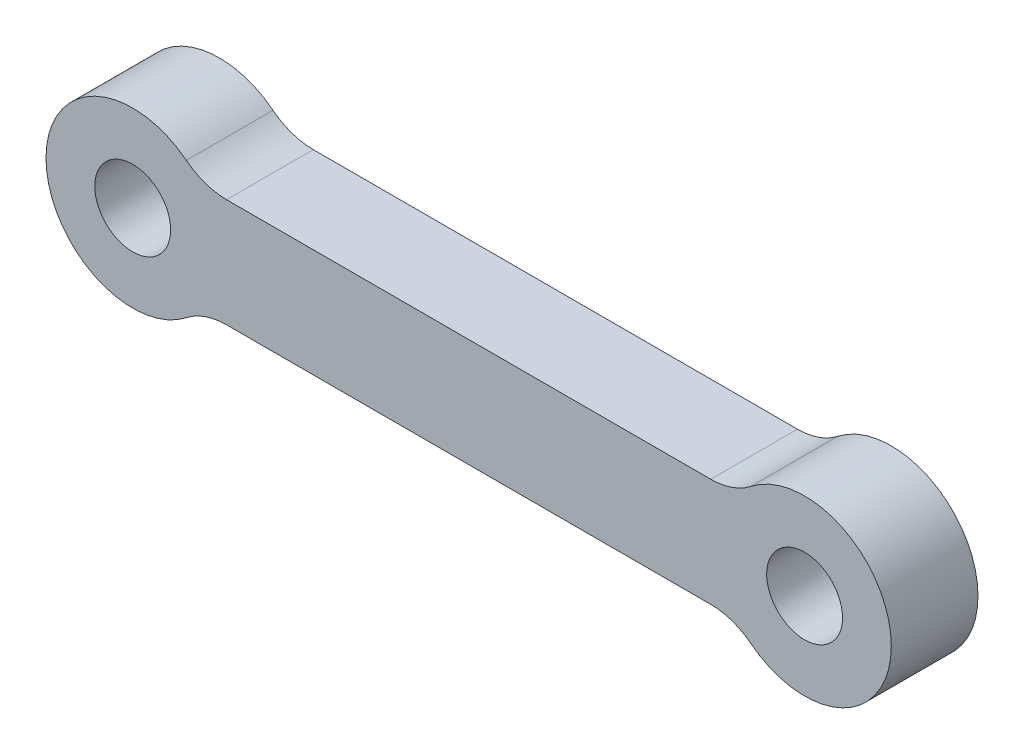
ISO-10303-21;
HEADER;
FILE_DESCRIPTION(('STEP AP214'),'2;1');
FILE_NAME('part.step','',(''),(''),'','','');
FILE_SCHEMA(('AUTOMOTIVE_DESIGN { 1 0 10303 214 1 1 1 1 }'));
ENDSEC;
DATA;
#1=APPLICATION_CONTEXT('core data for automotive mechanical design processes');
#2=APPLICATION_PROTOCOL_DEFINITION('international standard','automotive_design',2000,#1);
#3=PRODUCT_CONTEXT('',#1,'mechanical');
#4=PRODUCT('Part','Part','',(#3));
#5=PRODUCT_RELATED_PRODUCT_CATEGORY('part','',(#4));
#6=PRODUCT_DEFINITION_FORMATION('','',#4);
#7=PRODUCT_DEFINITION_CONTEXT('part definition',#1,'design');
#8=PRODUCT_DEFINITION('design','',#6,#7);
#9=PRODUCT_DEFINITION_SHAPE('','',#8);
#10=(LENGTH_UNIT() NAMED_UNIT(*) SI_UNIT(.MILLI.,.METRE.));
#11=(NAMED_UNIT(*) PLANE_ANGLE_UNIT() SI_UNIT($,.RADIAN.));
#12=(NAMED_UNIT(*) SI_UNIT($,.STERADIAN.) SOLID_ANGLE_UNIT());
#13=UNCERTAINTY_MEASURE_WITH_UNIT(LENGTH_MEASURE(1.E-05),#10,'distance_accuracy_value','');
#14=(GEOMETRIC_REPRESENTATION_CONTEXT(3) GLOBAL_UNCERTAINTY_ASSIGNED_CONTEXT((#13)) GLOBAL_UNIT_ASSIGNED_CONTEXT((#10,
#11,#12)) REPRESENTATION_CONTEXT('',''));
#15=CARTESIAN_POINT('',(0.,0.,0.));
#16=DIRECTION('',(0.,0.,1.));
#17=DIRECTION('',(1.,0.,0.));
#18=AXIS2_PLACEMENT_3D('',#15,#16,#17);
#19=CARTESIAN_POINT('',(-15.5,0.,4.));
#20=DIRECTION('',(0.,0.,-1.));
#21=DIRECTION('',(-1.,0.,0.));
#22=AXIS2_PLACEMENT_3D('',#19,#20,#21);
#23=CYLINDRICAL_SURFACE('',#22,4.);
#24=CARTESIAN_POINT('',(-15.5,0.,0.));
#25=DIRECTION('',(0.,0.,1.));
#26=DIRECTION('',(1.,0.,0.));
#27=AXIS2_PLACEMENT_3D('',#24,#25,#26);
#28=CIRCLE('',#27,4.);
#29=CARTESIAN_POINT('',(-13.025641703473,-3.14285714285714,0.));
#30=VERTEX_POINT('',#29);
#31=CARTESIAN_POINT('',(-13.025641703473,3.14285714285714,0.));
#32=VERTEX_POINT('',#31);
#33=EDGE_CURVE('E158',#30,#32,#28,.F.);
#34=ORIENTED_EDGE('',*,*,#33,.F.);
#35=DIRECTION('',(0.,0.,-1.));
#36=VECTOR('',#35,1.);
#37=CARTESIAN_POINT('',(-13.025641703473,-3.14285714285714,4.));
#38=LINE('',#37,#36);
#39=CARTESIAN_POINT('',(-13.025641703473,-3.14285714285714,4.));
#40=VERTEX_POINT('',#39);
#41=EDGE_CURVE('E182',#30,#40,#38,.F.);
#42=ORIENTED_EDGE('',*,*,#41,.T.);
#43=CARTESIAN_POINT('',(-15.5,0.,4.));
#44=DIRECTION('',(0.,0.,1.));
#45=DIRECTION('',(1.,0.,0.));
#46=AXIS2_PLACEMENT_3D('',#43,#44,#45);
#47=CIRCLE('',#46,4.);
#48=CARTESIAN_POINT('',(-13.025641703473,3.14285714285714,4.));
#49=VERTEX_POINT('',#48);
#50=EDGE_CURVE('E169',#40,#49,#47,.F.);
#51=ORIENTED_EDGE('',*,*,#50,.T.);
#52=DIRECTION('',(0.,0.,-1.));
#53=VECTOR('',#52,1.);
#54=CARTESIAN_POINT('',(-13.025641703473,3.14285714285714,4.));
#55=LINE('',#54,#53);
#56=EDGE_CURVE('E178',#49,#32,#55,.T.);
#57=ORIENTED_EDGE('',*,*,#56,.T.);
#58=EDGE_LOOP('',(#34,#42,#51,#57));
#59=FACE_BOUND('',#58,.T.);
#60=ADVANCED_FACE('F54',(#59),#23,.T.);
#61=CARTESIAN_POINT('',(0.,-2.5,4.));
#62=DIRECTION('',(0.,1.,0.));
#63=DIRECTION('',(-1.,0.,0.));
#64=AXIS2_PLACEMENT_3D('',#61,#62,#63);
#65=PLANE('',#64);
#66=DIRECTION('',(1.,0.,0.));
#67=VECTOR('',#66,1.);
#68=CARTESIAN_POINT('',(0.,-2.5,0.));
#69=LINE('',#68,#67);
#70=CARTESIAN_POINT('',(-11.1698729810778,-2.5,0.));
#71=VERTEX_POINT('',#70);
#72=CARTESIAN_POINT('',(11.1698729810778,-2.5,0.));
#73=VERTEX_POINT('',#72);
#74=EDGE_CURVE('E152',#71,#73,#69,.T.);
#75=ORIENTED_EDGE('',*,*,#74,.T.);
#76=DIRECTION('',(0.,0.,1.));
#77=VECTOR('',#76,1.);
#78=CARTESIAN_POINT('',(11.1698729810778,-2.5,4.));
#79=LINE('',#78,#77);
#80=CARTESIAN_POINT('',(11.1698729810778,-2.5,4.));
#81=VERTEX_POINT('',#80);
#82=EDGE_CURVE('E126',#73,#81,#79,.T.);
#83=ORIENTED_EDGE('',*,*,#82,.T.);
#84=DIRECTION('',(1.,0.,0.));
#85=VECTOR('',#84,1.);
#86=CARTESIAN_POINT('',(0.,-2.5,4.));
#87=LINE('',#86,#85);
#88=CARTESIAN_POINT('',(-11.1698729810778,-2.5,4.));
#89=VERTEX_POINT('',#88);
#90=EDGE_CURVE('E218',#89,#81,#87,.T.);
#91=ORIENTED_EDGE('',*,*,#90,.F.);
#92=DIRECTION('',(0.,0.,-1.));
#93=VECTOR('',#92,1.);
#94=CARTESIAN_POINT('',(-11.1698729810778,-2.5,4.));
#95=LINE('',#94,#93);
#96=EDGE_CURVE('E143',#89,#71,#95,.T.);
#97=ORIENTED_EDGE('',*,*,#96,.T.);
#98=EDGE_LOOP('',(#75,#83,#91,#97));
#99=FACE_BOUND('',#98,.T.);
#100=ADVANCED_FACE('F250',(#99),#65,.F.);
#101=CARTESIAN_POINT('',(15.5,0.,4.));
#102=DIRECTION('',(0.,0.,-1.));
#103=DIRECTION('',(-1.,0.,0.));
#104=AXIS2_PLACEMENT_3D('',#101,#102,#103);
#105=CYLINDRICAL_SURFACE('',#104,4.);
#106=CARTESIAN_POINT('',(15.5,0.,4.));
#107=DIRECTION('',(0.,0.,1.));
#108=DIRECTION('',(1.,0.,0.));
#109=AXIS2_PLACEMENT_3D('',#106,#107,#108);
#110=CIRCLE('',#109,4.);
#111=CARTESIAN_POINT('',(13.025641703473,-3.14285714285714,4.));
#112=VERTEX_POINT('',#111);
#113=CARTESIAN_POINT('',(13.025641703473,3.14285714285714,4.));
#114=VERTEX_POINT('',#113);
#115=EDGE_CURVE('E141',#112,#114,#110,.T.);
#116=ORIENTED_EDGE('',*,*,#115,.F.);
#117=DIRECTION('',(0.,0.,-1.));
#118=VECTOR('',#117,1.);
#119=CARTESIAN_POINT('',(13.025641703473,-3.14285714285714,4.));
#120=LINE('',#119,#118);
#121=CARTESIAN_POINT('',(13.025641703473,-3.14285714285714,0.));
#122=VERTEX_POINT('',#121);
#123=EDGE_CURVE('E125',#112,#122,#120,.T.);
#124=ORIENTED_EDGE('',*,*,#123,.T.);
#125=CARTESIAN_POINT('',(15.5,0.,0.));
#126=DIRECTION('',(0.,0.,1.));
#127=DIRECTION('',(1.,0.,0.));
#128=AXIS2_PLACEMENT_3D('',#125,#126,#127);
#129=CIRCLE('',#128,4.);
#130=CARTESIAN_POINT('',(13.025641703473,3.14285714285714,0.));
#131=VERTEX_POINT('',#130);
#132=EDGE_CURVE('E139',#122,#131,#129,.T.);
#133=ORIENTED_EDGE('',*,*,#132,.T.);
#134=DIRECTION('',(0.,0.,-1.));
#135=VECTOR('',#134,1.);
#136=CARTESIAN_POINT('',(13.025641703473,3.14285714285714,4.));
#137=LINE('',#136,#135);
#138=EDGE_CURVE('E144',#131,#114,#137,.F.);
#139=ORIENTED_EDGE('',*,*,#138,.T.);
#140=EDGE_LOOP('',(#116,#124,#133,#139));
#141=FACE_BOUND('',#140,.T.);
#142=ADVANCED_FACE('F138',(#141),#105,.T.);
#143=CARTESIAN_POINT('',(-15.5,0.,4.));
#144=DIRECTION('',(0.,0.,-1.));
#145=DIRECTION('',(-1.,0.,0.));
#146=AXIS2_PLACEMENT_3D('',#143,#144,#145);
#147=CYLINDRICAL_SURFACE('',#146,1.75);
#148=CARTESIAN_POINT('',(-15.5,0.,4.));
#149=DIRECTION('',(0.,0.,1.));
#150=DIRECTION('',(1.,0.,0.));
#151=AXIS2_PLACEMENT_3D('',#148,#149,#150);
#152=CIRCLE('',#151,1.75);
#153=CARTESIAN_POINT('',(-13.75,0.,4.));
#154=VERTEX_POINT('',#153);
#155=EDGE_CURVE('E228',#154,#154,#152,.F.);
#156=ORIENTED_EDGE('',*,*,#155,.F.);
#157=EDGE_LOOP('',(#156));
#158=FACE_BOUND('',#157,.T.);
#159=CARTESIAN_POINT('',(-15.5,0.,0.));
#160=DIRECTION('',(0.,0.,1.));
#161=DIRECTION('',(1.,0.,0.));
#162=AXIS2_PLACEMENT_3D('',#159,#160,#161);
#163=CIRCLE('',#162,1.75);
#164=CARTESIAN_POINT('',(-13.75,0.,0.));
#165=VERTEX_POINT('',#164);
#166=EDGE_CURVE('E156',#165,#165,#163,.F.);
#167=ORIENTED_EDGE('',*,*,#166,.T.);
#168=EDGE_LOOP('',(#167));
#169=FACE_BOUND('',#168,.T.);
#170=ADVANCED_FACE('F330',(#158,#169),#147,.F.);
#171=CARTESIAN_POINT('',(0.,2.49999999999999,4.));
#172=DIRECTION('',(0.,1.,0.));
#173=DIRECTION('',(-1.,0.,0.));
#174=AXIS2_PLACEMENT_3D('',#171,#172,#173);
#175=PLANE('',#174);
#176=DIRECTION('',(1.,0.,0.));
#177=VECTOR('',#176,1.);
#178=CARTESIAN_POINT('',(0.,2.49999999999999,4.));
#179=LINE('',#178,#177);
#180=CARTESIAN_POINT('',(-11.1698729810778,2.49999999999999,4.));
#181=VERTEX_POINT('',#180);
#182=CARTESIAN_POINT('',(11.1698729810778,2.5,4.));
#183=VERTEX_POINT('',#182);
#184=EDGE_CURVE('E214',#181,#183,#179,.T.);
#185=ORIENTED_EDGE('',*,*,#184,.T.);
#186=DIRECTION('',(0.,0.,-1.));
#187=VECTOR('',#186,1.);
#188=CARTESIAN_POINT('',(11.1698729810778,2.5,4.));
#189=LINE('',#188,#187);
#190=CARTESIAN_POINT('',(11.1698729810778,2.5,0.));
#191=VERTEX_POINT('',#190);
#192=EDGE_CURVE('E133',#183,#191,#189,.T.);
#193=ORIENTED_EDGE('',*,*,#192,.T.);
#194=DIRECTION('',(1.,0.,0.));
#195=VECTOR('',#194,1.);
#196=CARTESIAN_POINT('',(0.,2.49999999999999,0.));
#197=LINE('',#196,#195);
#198=CARTESIAN_POINT('',(-11.1698729810778,2.49999999999999,0.));
#199=VERTEX_POINT('',#198);
#200=EDGE_CURVE('E151',#199,#191,#197,.T.);
#201=ORIENTED_EDGE('',*,*,#200,.F.);
#202=DIRECTION('',(0.,0.,1.));
#203=VECTOR('',#202,1.);
#204=CARTESIAN_POINT('',(-11.1698729810778,2.49999999999999,4.));
#205=LINE('',#204,#203);
#206=EDGE_CURVE('E77',#199,#181,#205,.T.);
#207=ORIENTED_EDGE('',*,*,#206,.T.);
#208=EDGE_LOOP('',(#185,#193,#201,#207));
#209=FACE_BOUND('',#208,.T.);
#210=ADVANCED_FACE('F206',(#209),#175,.T.);
#211=CARTESIAN_POINT('',(15.5,0.,4.));
#212=DIRECTION('',(0.,0.,-1.));
#213=DIRECTION('',(-1.,0.,0.));
#214=AXIS2_PLACEMENT_3D('',#211,#212,#213);
#215=CYLINDRICAL_SURFACE('',#214,1.75);
#216=CARTESIAN_POINT('',(15.5,0.,4.));
#217=DIRECTION('',(0.,0.,1.));
#218=DIRECTION('',(1.,0.,0.));
#219=AXIS2_PLACEMENT_3D('',#216,#217,#218);
#220=CIRCLE('',#219,1.75);
#221=CARTESIAN_POINT('',(17.25,0.,4.));
#222=VERTEX_POINT('',#221);
#223=EDGE_CURVE('E171',#222,#222,#220,.T.);
#224=ORIENTED_EDGE('',*,*,#223,.T.);
#225=EDGE_LOOP('',(#224));
#226=FACE_BOUND('',#225,.T.);
#227=CARTESIAN_POINT('',(15.5,0.,0.));
#228=DIRECTION('',(0.,0.,1.));
#229=DIRECTION('',(1.,0.,0.));
#230=AXIS2_PLACEMENT_3D('',#227,#228,#229);
#231=CIRCLE('',#230,1.75);
#232=CARTESIAN_POINT('',(17.25,0.,0.));
#233=VERTEX_POINT('',#232);
#234=EDGE_CURVE('E165',#233,#233,#231,.T.);
#235=ORIENTED_EDGE('',*,*,#234,.F.);
#236=EDGE_LOOP('',(#235));
#237=FACE_BOUND('',#236,.T.);
#238=ADVANCED_FACE('F237',(#226,#237),#215,.F.);
#239=CARTESIAN_POINT('',(0.,0.,4.));
#240=DIRECTION('',(0.,0.,1.));
#241=DIRECTION('',(1.,0.,0.));
#242=AXIS2_PLACEMENT_3D('',#239,#240,#241);
#243=PLANE('',#242);
#244=ORIENTED_EDGE('',*,*,#50,.F.);
#245=CARTESIAN_POINT('',(-11.1698729810778,-5.5,4.));
#246=DIRECTION('',(0.,0.,1.));
#247=DIRECTION('',(1.,0.,0.));
#248=AXIS2_PLACEMENT_3D('',#245,#246,#247);
#249=CIRCLE('',#248,3.);
#250=EDGE_CURVE('E195',#40,#89,#249,.F.);
#251=ORIENTED_EDGE('',*,*,#250,.T.);
#252=ORIENTED_EDGE('',*,*,#90,.T.);
#253=CARTESIAN_POINT('',(11.1698729810778,-5.5,4.));
#254=DIRECTION('',(0.,0.,1.));
#255=DIRECTION('',(1.,0.,0.));
#256=AXIS2_PLACEMENT_3D('',#253,#254,#255);
#257=CIRCLE('',#256,3.);
#258=EDGE_CURVE('E132',#81,#112,#257,.F.);
#259=ORIENTED_EDGE('',*,*,#258,.T.);
#260=ORIENTED_EDGE('',*,*,#115,.T.);
#261=CARTESIAN_POINT('',(11.1698729810778,5.5,4.));
#262=DIRECTION('',(0.,0.,1.));
#263=DIRECTION('',(1.,0.,0.));
#264=AXIS2_PLACEMENT_3D('',#261,#262,#263);
#265=CIRCLE('',#264,3.);
#266=EDGE_CURVE('E70',#114,#183,#265,.F.);
#267=ORIENTED_EDGE('',*,*,#266,.T.);
#268=ORIENTED_EDGE('',*,*,#184,.F.);
#269=CARTESIAN_POINT('',(-11.1698729810778,5.49999999999999,4.));
#270=DIRECTION('',(0.,0.,1.));
#271=DIRECTION('',(1.,0.,0.));
#272=AXIS2_PLACEMENT_3D('',#269,#270,#271);
#273=CIRCLE('',#272,3.);
#274=EDGE_CURVE('E11',#181,#49,#273,.F.);
#275=ORIENTED_EDGE('',*,*,#274,.T.);
#276=EDGE_LOOP('',(#244,#251,#252,#259,#260,#267,#268,#275));
#277=FACE_BOUND('',#276,.T.);
#278=ORIENTED_EDGE('',*,*,#155,.T.);
#279=EDGE_LOOP('',(#278));
#280=FACE_BOUND('',#279,.T.);
#281=ORIENTED_EDGE('',*,*,#223,.F.);
#282=EDGE_LOOP('',(#281));
#283=FACE_BOUND('',#282,.T.);
#284=ADVANCED_FACE('F211',(#277,#280,#283),#243,.T.);
#285=CARTESIAN_POINT('',(0.,0.,0.));
#286=DIRECTION('',(0.,0.,1.));
#287=DIRECTION('',(1.,0.,0.));
#288=AXIS2_PLACEMENT_3D('',#285,#286,#287);
#289=PLANE('',#288);
#290=ORIENTED_EDGE('',*,*,#74,.F.);
#291=CARTESIAN_POINT('',(-11.1698729810778,-5.5,0.));
#292=DIRECTION('',(0.,0.,1.));
#293=DIRECTION('',(1.,0.,0.));
#294=AXIS2_PLACEMENT_3D('',#291,#292,#293);
#295=CIRCLE('',#294,3.);
#296=EDGE_CURVE('E192',#71,#30,#295,.T.);
#297=ORIENTED_EDGE('',*,*,#296,.T.);
#298=ORIENTED_EDGE('',*,*,#33,.T.);
#299=CARTESIAN_POINT('',(-11.1698729810778,5.49999999999999,0.));
#300=DIRECTION('',(0.,0.,1.));
#301=DIRECTION('',(1.,0.,0.));
#302=AXIS2_PLACEMENT_3D('',#299,#300,#301);
#303=CIRCLE('',#302,3.);
#304=EDGE_CURVE('E63',#32,#199,#303,.T.);
#305=ORIENTED_EDGE('',*,*,#304,.T.);
#306=ORIENTED_EDGE('',*,*,#200,.T.);
#307=CARTESIAN_POINT('',(11.1698729810778,5.5,0.));
#308=DIRECTION('',(0.,0.,1.));
#309=DIRECTION('',(1.,0.,0.));
#310=AXIS2_PLACEMENT_3D('',#307,#308,#309);
#311=CIRCLE('',#310,3.);
#312=EDGE_CURVE('E149',#191,#131,#311,.T.);
#313=ORIENTED_EDGE('',*,*,#312,.T.);
#314=ORIENTED_EDGE('',*,*,#132,.F.);
#315=CARTESIAN_POINT('',(11.1698729810778,-5.5,0.));
#316=DIRECTION('',(0.,0.,1.));
#317=DIRECTION('',(1.,0.,0.));
#318=AXIS2_PLACEMENT_3D('',#315,#316,#317);
#319=CIRCLE('',#318,3.);
#320=EDGE_CURVE('E121',#122,#73,#319,.T.);
#321=ORIENTED_EDGE('',*,*,#320,.T.);
#322=EDGE_LOOP('',(#290,#297,#298,#305,#306,#313,#314,#321));
#323=FACE_BOUND('',#322,.T.);
#324=ORIENTED_EDGE('',*,*,#166,.F.);
#325=EDGE_LOOP('',(#324));
#326=FACE_BOUND('',#325,.T.);
#327=ORIENTED_EDGE('',*,*,#234,.T.);
#328=EDGE_LOOP('',(#327));
#329=FACE_BOUND('',#328,.T.);
#330=ADVANCED_FACE('F146',(#323,#326,#329),#289,.F.);
#331=CARTESIAN_POINT('',(11.1698729810778,-5.5,4.));
#332=DIRECTION('',(0.,0.,-1.));
#333=DIRECTION('',(-1.,0.,0.));
#334=AXIS2_PLACEMENT_3D('',#331,#332,#333);
#335=CYLINDRICAL_SURFACE('',#334,3.);
#336=ORIENTED_EDGE('',*,*,#258,.F.);
#337=ORIENTED_EDGE('',*,*,#82,.F.);
#338=ORIENTED_EDGE('',*,*,#320,.F.);
#339=ORIENTED_EDGE('',*,*,#123,.F.);
#340=EDGE_LOOP('',(#336,#337,#338,#339));
#341=FACE_BOUND('',#340,.T.);
#342=ADVANCED_FACE('F124',(#341),#335,.F.);
#343=CARTESIAN_POINT('',(-11.1698729810778,-5.5,4.));
#344=DIRECTION('',(0.,0.,-1.));
#345=DIRECTION('',(-1.,0.,0.));
#346=AXIS2_PLACEMENT_3D('',#343,#344,#345);
#347=CYLINDRICAL_SURFACE('',#346,3.);
#348=ORIENTED_EDGE('',*,*,#250,.F.);
#349=ORIENTED_EDGE('',*,*,#41,.F.);
#350=ORIENTED_EDGE('',*,*,#296,.F.);
#351=ORIENTED_EDGE('',*,*,#96,.F.);
#352=EDGE_LOOP('',(#348,#349,#350,#351));
#353=FACE_BOUND('',#352,.T.);
#354=ADVANCED_FACE('F262',(#353),#347,.F.);
#355=CARTESIAN_POINT('',(11.1698729810778,5.5,4.));
#356=DIRECTION('',(0.,0.,-1.));
#357=DIRECTION('',(-1.,0.,0.));
#358=AXIS2_PLACEMENT_3D('',#355,#356,#357);
#359=CYLINDRICAL_SURFACE('',#358,3.);
#360=ORIENTED_EDGE('',*,*,#266,.F.);
#361=ORIENTED_EDGE('',*,*,#138,.F.);
#362=ORIENTED_EDGE('',*,*,#312,.F.);
#363=ORIENTED_EDGE('',*,*,#192,.F.);
#364=EDGE_LOOP('',(#360,#361,#362,#363));
#365=FACE_BOUND('',#364,.T.);
#366=ADVANCED_FACE('F264',(#365),#359,.F.);
#367=CARTESIAN_POINT('',(-11.1698729810778,5.49999999999999,4.));
#368=DIRECTION('',(0.,0.,-1.));
#369=DIRECTION('',(-1.,0.,0.));
#370=AXIS2_PLACEMENT_3D('',#367,#368,#369);
#371=CYLINDRICAL_SURFACE('',#370,3.);
#372=ORIENTED_EDGE('',*,*,#274,.F.);
#373=ORIENTED_EDGE('',*,*,#206,.F.);
#374=ORIENTED_EDGE('',*,*,#304,.F.);
#375=ORIENTED_EDGE('',*,*,#56,.F.);
#376=EDGE_LOOP('',(#372,#373,#374,#375));
#377=FACE_BOUND('',#376,.T.);
#378=ADVANCED_FACE('F56',(#377),#371,.F.);
#379=CLOSED_SHELL('',(#60,#100,#142,#170,#210,#238,#284,#330,#342,#354,#366,#378));
#380=MANIFOLD_SOLID_BREP('B2',#379);
#381=ADVANCED_BREP_SHAPE_REPRESENTATION('',(#18,#380),#14);
#382=SHAPE_DEFINITION_REPRESENTATION(#9,#381);
ENDSEC;
END-ISO-10303-21;
